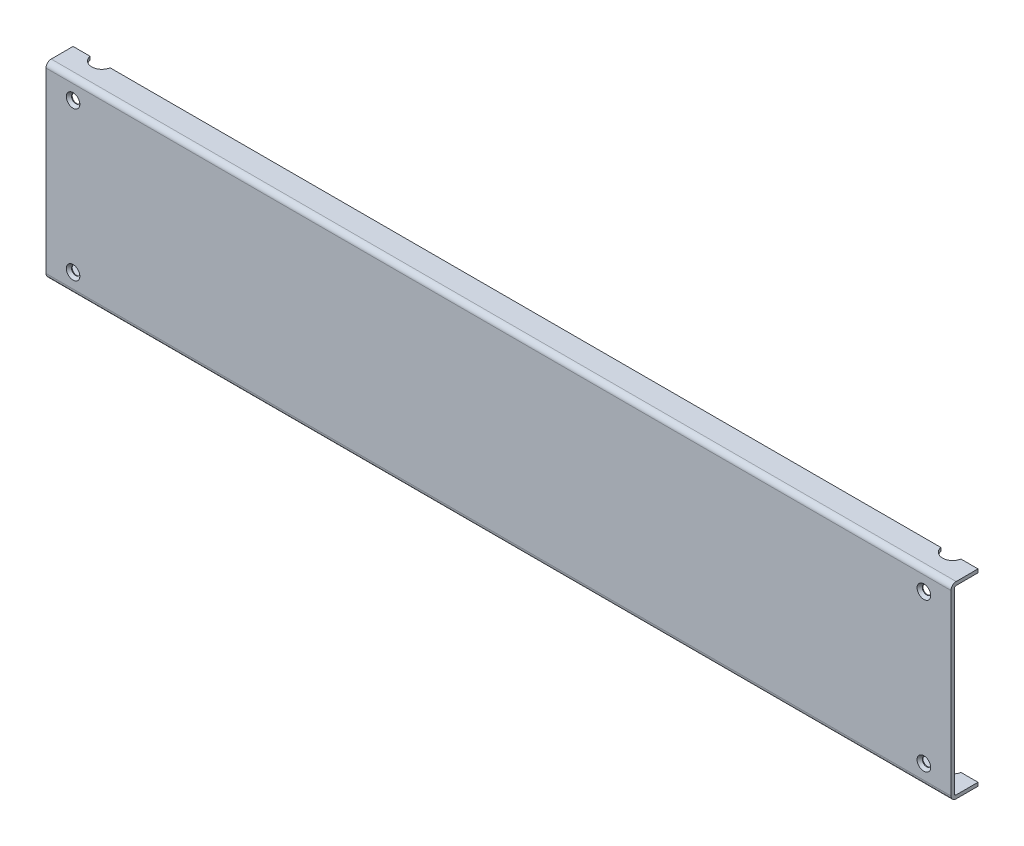
ISO-10303-21;
HEADER;
FILE_DESCRIPTION(('STEP AP214'),'2;1');
FILE_NAME('part.step','',(''),(''),'','','');
FILE_SCHEMA(('AUTOMOTIVE_DESIGN { 1 0 10303 214 1 1 1 1 }'));
ENDSEC;
DATA;
#1=APPLICATION_CONTEXT('core data for automotive mechanical design processes');
#2=APPLICATION_PROTOCOL_DEFINITION('international standard','automotive_design',2000,#1);
#3=PRODUCT_CONTEXT('',#1,'mechanical');
#4=PRODUCT('Part','Part','',(#3));
#5=PRODUCT_RELATED_PRODUCT_CATEGORY('part','',(#4));
#6=PRODUCT_DEFINITION_FORMATION('','',#4);
#7=PRODUCT_DEFINITION_CONTEXT('part definition',#1,'design');
#8=PRODUCT_DEFINITION('design','',#6,#7);
#9=PRODUCT_DEFINITION_SHAPE('','',#8);
#10=(LENGTH_UNIT() NAMED_UNIT(*) SI_UNIT(.MILLI.,.METRE.));
#11=(NAMED_UNIT(*) PLANE_ANGLE_UNIT() SI_UNIT($,.RADIAN.));
#12=(NAMED_UNIT(*) SI_UNIT($,.STERADIAN.) SOLID_ANGLE_UNIT());
#13=UNCERTAINTY_MEASURE_WITH_UNIT(LENGTH_MEASURE(1.E-05),#10,'distance_accuracy_value','');
#14=(GEOMETRIC_REPRESENTATION_CONTEXT(3) GLOBAL_UNCERTAINTY_ASSIGNED_CONTEXT((#13)) GLOBAL_UNIT_ASSIGNED_CONTEXT((#10,
#11,#12)) REPRESENTATION_CONTEXT('',''));
#15=CARTESIAN_POINT('',(0.,0.,0.));
#16=DIRECTION('',(0.,0.,1.));
#17=DIRECTION('',(1.,0.,0.));
#18=AXIS2_PLACEMENT_3D('',#15,#16,#17);
#19=CARTESIAN_POINT('',(199.6186,389.769720897378,-13.5382));
#20=DIRECTION('',(0.,1.,0.));
#21=DIRECTION('',(0.,0.,1.));
#22=AXIS2_PLACEMENT_3D('',#19,#20,#21);
#23=CYLINDRICAL_SURFACE('',#22,4.7752);
#24=CARTESIAN_POINT('',(199.6186,-42.545,-13.5382));
#25=DIRECTION('',(0.,1.,0.));
#26=DIRECTION('',(0.,0.,1.));
#27=AXIS2_PLACEMENT_3D('',#24,#25,#26);
#28=CIRCLE('',#27,4.7752);
#29=CARTESIAN_POINT('',(194.917540991649,-42.545,-12.7));
#30=VERTEX_POINT('',#29);
#31=CARTESIAN_POINT('',(204.319659008351,-42.545,-12.7));
#32=VERTEX_POINT('',#31);
#33=EDGE_CURVE('E266',#30,#32,#28,.T.);
#34=ORIENTED_EDGE('',*,*,#33,.T.);
#35=DIRECTION('',(0.,1.,0.));
#36=VECTOR('',#35,1.);
#37=CARTESIAN_POINT('',(204.319659008351,-44.1706,-12.7));
#38=LINE('',#37,#36);
#39=CARTESIAN_POINT('',(204.319659008351,-44.1706,-12.7));
#40=VERTEX_POINT('',#39);
#41=EDGE_CURVE('E194',#32,#40,#38,.F.);
#42=ORIENTED_EDGE('',*,*,#41,.T.);
#43=CARTESIAN_POINT('',(199.6186,-44.1706,-13.5382));
#44=DIRECTION('',(0.,1.,0.));
#45=DIRECTION('',(0.,0.,1.));
#46=AXIS2_PLACEMENT_3D('',#43,#44,#45);
#47=CIRCLE('',#46,4.7752);
#48=CARTESIAN_POINT('',(194.917540991649,-44.1706,-12.7));
#49=VERTEX_POINT('',#48);
#50=EDGE_CURVE('E271',#49,#40,#47,.T.);
#51=ORIENTED_EDGE('',*,*,#50,.F.);
#52=DIRECTION('',(0.,1.,0.));
#53=VECTOR('',#52,1.);
#54=CARTESIAN_POINT('',(194.917540991649,-44.1706,-12.7));
#55=LINE('',#54,#53);
#56=EDGE_CURVE('E186',#49,#30,#55,.T.);
#57=ORIENTED_EDGE('',*,*,#56,.T.);
#58=EDGE_LOOP('',(#34,#42,#51,#57));
#59=FACE_BOUND('',#58,.T.);
#60=ADVANCED_FACE('F17',(#59),#23,.F.);
#61=CARTESIAN_POINT('',(-212.3186,-44.1706,-12.7));
#62=DIRECTION('',(0.,0.,1.));
#63=DIRECTION('',(1.,0.,0.));
#64=AXIS2_PLACEMENT_3D('',#61,#62,#63);
#65=PLANE('',#64);
#66=DIRECTION('',(1.,0.,0.));
#67=VECTOR('',#66,1.);
#68=CARTESIAN_POINT('',(212.3186,-42.545,-12.7));
#69=LINE('',#68,#67);
#70=CARTESIAN_POINT('',(212.3186,-42.545,-12.7));
#71=VERTEX_POINT('',#70);
#72=EDGE_CURVE('E269',#32,#71,#69,.T.);
#73=ORIENTED_EDGE('',*,*,#72,.T.);
#74=DIRECTION('',(0.,1.,0.));
#75=VECTOR('',#74,1.);
#76=CARTESIAN_POINT('',(212.3186,-44.1706,-12.7));
#77=LINE('',#76,#75);
#78=CARTESIAN_POINT('',(212.3186,-44.1706,-12.7));
#79=VERTEX_POINT('',#78);
#80=EDGE_CURVE('E199',#79,#71,#77,.T.);
#81=ORIENTED_EDGE('',*,*,#80,.F.);
#82=DIRECTION('',(1.,0.,0.));
#83=VECTOR('',#82,1.);
#84=CARTESIAN_POINT('',(212.3186,-44.1706,-12.7));
#85=LINE('',#84,#83);
#86=EDGE_CURVE('E273',#40,#79,#85,.T.);
#87=ORIENTED_EDGE('',*,*,#86,.F.);
#88=ORIENTED_EDGE('',*,*,#41,.F.);
#89=EDGE_LOOP('',(#73,#81,#87,#88));
#90=FACE_BOUND('',#89,.T.);
#91=ADVANCED_FACE('F462',(#90),#65,.F.);
#92=CARTESIAN_POINT('',(-212.3186,-44.1706,-12.7));
#93=DIRECTION('',(0.,0.,1.));
#94=DIRECTION('',(1.,0.,0.));
#95=AXIS2_PLACEMENT_3D('',#92,#93,#94);
#96=PLANE('',#95);
#97=DIRECTION('',(0.,1.,0.));
#98=VECTOR('',#97,1.);
#99=CARTESIAN_POINT('',(-204.319659008351,389.769720897378,-12.6999999999999));
#100=LINE('',#99,#98);
#101=CARTESIAN_POINT('',(-204.319659008351,-42.545,-12.7));
#102=VERTEX_POINT('',#101);
#103=CARTESIAN_POINT('',(-204.319659008351,-44.1706,-12.7));
#104=VERTEX_POINT('',#103);
#105=EDGE_CURVE('E189',#102,#104,#100,.F.);
#106=ORIENTED_EDGE('',*,*,#105,.T.);
#107=DIRECTION('',(1.,0.,0.));
#108=VECTOR('',#107,1.);
#109=CARTESIAN_POINT('',(212.3186,-44.1706,-12.7));
#110=LINE('',#109,#108);
#111=CARTESIAN_POINT('',(-212.3186,-44.1706,-12.7));
#112=VERTEX_POINT('',#111);
#113=EDGE_CURVE('E270',#112,#104,#110,.T.);
#114=ORIENTED_EDGE('',*,*,#113,.F.);
#115=DIRECTION('',(0.,1.,0.));
#116=VECTOR('',#115,1.);
#117=CARTESIAN_POINT('',(-212.3186,-44.1706,-12.7));
#118=LINE('',#117,#116);
#119=CARTESIAN_POINT('',(-212.3186,-42.545,-12.7));
#120=VERTEX_POINT('',#119);
#121=EDGE_CURVE('E191',#120,#112,#118,.F.);
#122=ORIENTED_EDGE('',*,*,#121,.F.);
#123=DIRECTION('',(1.,0.,0.));
#124=VECTOR('',#123,1.);
#125=CARTESIAN_POINT('',(212.3186,-42.545,-12.7));
#126=LINE('',#125,#124);
#127=EDGE_CURVE('E265',#120,#102,#126,.T.);
#128=ORIENTED_EDGE('',*,*,#127,.T.);
#129=EDGE_LOOP('',(#106,#114,#122,#128));
#130=FACE_BOUND('',#129,.T.);
#131=ADVANCED_FACE('F469',(#130),#96,.F.);
#132=CARTESIAN_POINT('',(-199.6186,389.769720897378,-13.5382));
#133=DIRECTION('',(0.,1.,0.));
#134=DIRECTION('',(0.,0.,1.));
#135=AXIS2_PLACEMENT_3D('',#132,#133,#134);
#136=CYLINDRICAL_SURFACE('',#135,4.7752);
#137=DIRECTION('',(0.,1.,0.));
#138=VECTOR('',#137,1.);
#139=CARTESIAN_POINT('',(-194.917540991649,-44.1706,-12.7));
#140=LINE('',#139,#138);
#141=CARTESIAN_POINT('',(-194.917540991649,-42.545,-12.7));
#142=VERTEX_POINT('',#141);
#143=CARTESIAN_POINT('',(-194.917540991649,-44.1706,-12.7));
#144=VERTEX_POINT('',#143);
#145=EDGE_CURVE('E181',#142,#144,#140,.F.);
#146=ORIENTED_EDGE('',*,*,#145,.T.);
#147=CARTESIAN_POINT('',(-199.6186,-44.1706,-13.5382));
#148=DIRECTION('',(0.,1.,0.));
#149=DIRECTION('',(0.,0.,1.));
#150=AXIS2_PLACEMENT_3D('',#147,#148,#149);
#151=CIRCLE('',#150,4.7752);
#152=EDGE_CURVE('E275',#104,#144,#151,.T.);
#153=ORIENTED_EDGE('',*,*,#152,.F.);
#154=ORIENTED_EDGE('',*,*,#105,.F.);
#155=CARTESIAN_POINT('',(-199.6186,-42.545,-13.5382));
#156=DIRECTION('',(0.,1.,0.));
#157=DIRECTION('',(0.,0.,1.));
#158=AXIS2_PLACEMENT_3D('',#155,#156,#157);
#159=CIRCLE('',#158,4.7752);
#160=EDGE_CURVE('E261',#102,#142,#159,.T.);
#161=ORIENTED_EDGE('',*,*,#160,.T.);
#162=EDGE_LOOP('',(#146,#153,#154,#161));
#163=FACE_BOUND('',#162,.T.);
#164=ADVANCED_FACE('F473',(#163),#136,.F.);
#165=CARTESIAN_POINT('',(-212.3186,-44.1706,-12.7));
#166=DIRECTION('',(0.,0.,1.));
#167=DIRECTION('',(1.,0.,0.));
#168=AXIS2_PLACEMENT_3D('',#165,#166,#167);
#169=PLANE('',#168);
#170=ORIENTED_EDGE('',*,*,#145,.F.);
#171=DIRECTION('',(1.,0.,0.));
#172=VECTOR('',#171,1.);
#173=CARTESIAN_POINT('',(212.3186,-42.545,-12.7));
#174=LINE('',#173,#172);
#175=EDGE_CURVE('E264',#142,#30,#174,.T.);
#176=ORIENTED_EDGE('',*,*,#175,.T.);
#177=ORIENTED_EDGE('',*,*,#56,.F.);
#178=DIRECTION('',(1.,0.,0.));
#179=VECTOR('',#178,1.);
#180=CARTESIAN_POINT('',(212.3186,-44.1706,-12.7));
#181=LINE('',#180,#179);
#182=EDGE_CURVE('E274',#144,#49,#181,.T.);
#183=ORIENTED_EDGE('',*,*,#182,.F.);
#184=EDGE_LOOP('',(#170,#176,#177,#183));
#185=FACE_BOUND('',#184,.T.);
#186=ADVANCED_FACE('F476',(#185),#169,.F.);
#187=CARTESIAN_POINT('',(212.3186,44.1706,-12.7));
#188=DIRECTION('',(0.,0.,1.));
#189=DIRECTION('',(1.,0.,0.));
#190=AXIS2_PLACEMENT_3D('',#187,#188,#189);
#191=PLANE('',#190);
#192=DIRECTION('',(1.,0.,0.));
#193=VECTOR('',#192,1.);
#194=CARTESIAN_POINT('',(-212.3186,44.1706,-12.7));
#195=LINE('',#194,#193);
#196=CARTESIAN_POINT('',(212.3186,44.1706,-12.7));
#197=VERTEX_POINT('',#196);
#198=CARTESIAN_POINT('',(204.319659008351,44.1706,-12.7));
#199=VERTEX_POINT('',#198);
#200=EDGE_CURVE('E159',#197,#199,#195,.F.);
#201=ORIENTED_EDGE('',*,*,#200,.F.);
#202=DIRECTION('',(0.,1.,0.));
#203=VECTOR('',#202,1.);
#204=CARTESIAN_POINT('',(212.3186,44.1706,-12.7));
#205=LINE('',#204,#203);
#206=CARTESIAN_POINT('',(212.3186,42.545,-12.7));
#207=VERTEX_POINT('',#206);
#208=EDGE_CURVE('E178',#207,#197,#205,.T.);
#209=ORIENTED_EDGE('',*,*,#208,.F.);
#210=DIRECTION('',(1.,0.,0.));
#211=VECTOR('',#210,1.);
#212=CARTESIAN_POINT('',(-212.3186,42.545,-12.7));
#213=LINE('',#212,#211);
#214=CARTESIAN_POINT('',(204.319659008351,42.545,-12.7));
#215=VERTEX_POINT('',#214);
#216=EDGE_CURVE('E260',#207,#215,#213,.F.);
#217=ORIENTED_EDGE('',*,*,#216,.T.);
#218=DIRECTION('',(0.,-1.,0.));
#219=VECTOR('',#218,1.);
#220=CARTESIAN_POINT('',(204.319659008351,-389.769720897378,-12.6999999999999));
#221=LINE('',#220,#219);
#222=EDGE_CURVE('E175',#215,#199,#221,.F.);
#223=ORIENTED_EDGE('',*,*,#222,.T.);
#224=EDGE_LOOP('',(#201,#209,#217,#223));
#225=FACE_BOUND('',#224,.T.);
#226=ADVANCED_FACE('F438',(#225),#191,.F.);
#227=CARTESIAN_POINT('',(199.6186,-389.769720897378,-13.5382));
#228=DIRECTION('',(0.,-1.,0.));
#229=DIRECTION('',(0.,0.,-1.));
#230=AXIS2_PLACEMENT_3D('',#227,#228,#229);
#231=CYLINDRICAL_SURFACE('',#230,4.7752);
#232=CARTESIAN_POINT('',(199.6186,42.545,-13.5382));
#233=DIRECTION('',(0.,-1.,0.));
#234=DIRECTION('',(0.,0.,-1.));
#235=AXIS2_PLACEMENT_3D('',#232,#233,#234);
#236=CIRCLE('',#235,4.7752);
#237=CARTESIAN_POINT('',(194.917540991649,42.545,-12.7));
#238=VERTEX_POINT('',#237);
#239=EDGE_CURVE('E257',#215,#238,#236,.T.);
#240=ORIENTED_EDGE('',*,*,#239,.T.);
#241=DIRECTION('',(0.,1.,0.));
#242=VECTOR('',#241,1.);
#243=CARTESIAN_POINT('',(194.917540991649,44.1706,-12.7));
#244=LINE('',#243,#242);
#245=CARTESIAN_POINT('',(194.917540991649,44.1706,-12.7));
#246=VERTEX_POINT('',#245);
#247=EDGE_CURVE('E172',#238,#246,#244,.T.);
#248=ORIENTED_EDGE('',*,*,#247,.T.);
#249=CARTESIAN_POINT('',(199.6186,44.1706,-13.5382));
#250=DIRECTION('',(0.,-1.,0.));
#251=DIRECTION('',(0.,0.,-1.));
#252=AXIS2_PLACEMENT_3D('',#249,#250,#251);
#253=CIRCLE('',#252,4.7752);
#254=EDGE_CURVE('E161',#199,#246,#253,.T.);
#255=ORIENTED_EDGE('',*,*,#254,.F.);
#256=ORIENTED_EDGE('',*,*,#222,.F.);
#257=EDGE_LOOP('',(#240,#248,#255,#256));
#258=FACE_BOUND('',#257,.T.);
#259=ADVANCED_FACE('F495',(#258),#231,.F.);
#260=CARTESIAN_POINT('',(212.3186,44.1706,-12.7));
#261=DIRECTION('',(0.,0.,1.));
#262=DIRECTION('',(1.,0.,0.));
#263=AXIS2_PLACEMENT_3D('',#260,#261,#262);
#264=PLANE('',#263);
#265=DIRECTION('',(0.,-1.,0.));
#266=VECTOR('',#265,1.);
#267=CARTESIAN_POINT('',(-194.917540991649,-389.769720897378,-12.6999999999999));
#268=LINE('',#267,#266);
#269=CARTESIAN_POINT('',(-194.917540991649,42.545,-12.7));
#270=VERTEX_POINT('',#269);
#271=CARTESIAN_POINT('',(-194.917540991649,44.1706,-12.7));
#272=VERTEX_POINT('',#271);
#273=EDGE_CURVE('E132',#270,#272,#268,.F.);
#274=ORIENTED_EDGE('',*,*,#273,.T.);
#275=DIRECTION('',(1.,0.,0.));
#276=VECTOR('',#275,1.);
#277=CARTESIAN_POINT('',(-212.3186,44.1706,-12.7));
#278=LINE('',#277,#276);
#279=EDGE_CURVE('E144',#246,#272,#278,.F.);
#280=ORIENTED_EDGE('',*,*,#279,.F.);
#281=ORIENTED_EDGE('',*,*,#247,.F.);
#282=DIRECTION('',(1.,0.,0.));
#283=VECTOR('',#282,1.);
#284=CARTESIAN_POINT('',(-212.3186,42.545,-12.7));
#285=LINE('',#284,#283);
#286=EDGE_CURVE('E256',#238,#270,#285,.F.);
#287=ORIENTED_EDGE('',*,*,#286,.T.);
#288=EDGE_LOOP('',(#274,#280,#281,#287));
#289=FACE_BOUND('',#288,.T.);
#290=ADVANCED_FACE('F498',(#289),#264,.F.);
#291=CARTESIAN_POINT('',(-199.6186,-389.769720897378,-13.5382));
#292=DIRECTION('',(0.,-1.,0.));
#293=DIRECTION('',(0.,0.,-1.));
#294=AXIS2_PLACEMENT_3D('',#291,#292,#293);
#295=CYLINDRICAL_SURFACE('',#294,4.7752);
#296=DIRECTION('',(0.,1.,0.));
#297=VECTOR('',#296,1.);
#298=CARTESIAN_POINT('',(-204.319659008351,44.1706,-12.7));
#299=LINE('',#298,#297);
#300=CARTESIAN_POINT('',(-204.319659008351,42.545,-12.7));
#301=VERTEX_POINT('',#300);
#302=CARTESIAN_POINT('',(-204.319659008351,44.1706,-12.7));
#303=VERTEX_POINT('',#302);
#304=EDGE_CURVE('E146',#301,#303,#299,.T.);
#305=ORIENTED_EDGE('',*,*,#304,.T.);
#306=CARTESIAN_POINT('',(-199.6186,44.1706,-13.5382));
#307=DIRECTION('',(0.,-1.,0.));
#308=DIRECTION('',(0.,0.,-1.));
#309=AXIS2_PLACEMENT_3D('',#306,#307,#308);
#310=CIRCLE('',#309,4.7752);
#311=EDGE_CURVE('E20',#272,#303,#310,.T.);
#312=ORIENTED_EDGE('',*,*,#311,.F.);
#313=ORIENTED_EDGE('',*,*,#273,.F.);
#314=CARTESIAN_POINT('',(-199.6186,42.545,-13.5382));
#315=DIRECTION('',(0.,-1.,0.));
#316=DIRECTION('',(0.,0.,-1.));
#317=AXIS2_PLACEMENT_3D('',#314,#315,#316);
#318=CIRCLE('',#317,4.7752);
#319=EDGE_CURVE('E150',#270,#301,#318,.T.);
#320=ORIENTED_EDGE('',*,*,#319,.T.);
#321=EDGE_LOOP('',(#305,#312,#313,#320));
#322=FACE_BOUND('',#321,.T.);
#323=ADVANCED_FACE('F148',(#322),#295,.F.);
#324=CARTESIAN_POINT('',(212.3186,44.1706,-12.7));
#325=DIRECTION('',(0.,0.,1.));
#326=DIRECTION('',(1.,0.,0.));
#327=AXIS2_PLACEMENT_3D('',#324,#325,#326);
#328=PLANE('',#327);
#329=ORIENTED_EDGE('',*,*,#304,.F.);
#330=DIRECTION('',(1.,0.,0.));
#331=VECTOR('',#330,1.);
#332=CARTESIAN_POINT('',(-212.3186,42.545,-12.7));
#333=LINE('',#332,#331);
#334=CARTESIAN_POINT('',(-212.3186,42.545,-12.7));
#335=VERTEX_POINT('',#334);
#336=EDGE_CURVE('E254',#301,#335,#333,.F.);
#337=ORIENTED_EDGE('',*,*,#336,.T.);
#338=DIRECTION('',(0.,1.,0.));
#339=VECTOR('',#338,1.);
#340=CARTESIAN_POINT('',(-212.3186,44.1706,-12.7));
#341=LINE('',#340,#339);
#342=CARTESIAN_POINT('',(-212.3186,44.1706,-12.7));
#343=VERTEX_POINT('',#342);
#344=EDGE_CURVE('E154',#343,#335,#341,.F.);
#345=ORIENTED_EDGE('',*,*,#344,.F.);
#346=DIRECTION('',(1.,0.,0.));
#347=VECTOR('',#346,1.);
#348=CARTESIAN_POINT('',(-212.3186,44.1706,-12.7));
#349=LINE('',#348,#347);
#350=EDGE_CURVE('E142',#303,#343,#349,.F.);
#351=ORIENTED_EDGE('',*,*,#350,.F.);
#352=EDGE_LOOP('',(#329,#337,#345,#351));
#353=FACE_BOUND('',#352,.T.);
#354=ADVANCED_FACE('F157',(#353),#328,.F.);
#355=CARTESIAN_POINT('',(-212.3186,44.1706,-1.38393774617544));
#356=DIRECTION('',(0.,1.,0.));
#357=DIRECTION('',(0.,0.,1.));
#358=AXIS2_PLACEMENT_3D('',#355,#356,#357);
#359=PLANE('',#358);
#360=ORIENTED_EDGE('',*,*,#254,.T.);
#361=ORIENTED_EDGE('',*,*,#279,.T.);
#362=ORIENTED_EDGE('',*,*,#311,.T.);
#363=ORIENTED_EDGE('',*,*,#350,.T.);
#364=DIRECTION('',(0.,0.,1.));
#365=VECTOR('',#364,1.);
#366=CARTESIAN_POINT('',(-212.3186,44.1706,-1.6256));
#367=LINE('',#366,#365);
#368=CARTESIAN_POINT('',(-212.3186,44.1706,-2.4384));
#369=VERTEX_POINT('',#368);
#370=EDGE_CURVE('E240',#369,#343,#367,.F.);
#371=ORIENTED_EDGE('',*,*,#370,.F.);
#372=DIRECTION('',(1.,0.,0.));
#373=VECTOR('',#372,1.);
#374=CARTESIAN_POINT('',(212.3186,44.1706,-2.4384));
#375=LINE('',#374,#373);
#376=CARTESIAN_POINT('',(212.3186,44.1706,-2.4384));
#377=VERTEX_POINT('',#376);
#378=EDGE_CURVE('E278',#377,#369,#375,.F.);
#379=ORIENTED_EDGE('',*,*,#378,.F.);
#380=DIRECTION('',(0.,0.,-1.));
#381=VECTOR('',#380,1.);
#382=CARTESIAN_POINT('',(212.3186,44.1706,-1.6256));
#383=LINE('',#382,#381);
#384=EDGE_CURVE('E228',#197,#377,#383,.F.);
#385=ORIENTED_EDGE('',*,*,#384,.F.);
#386=ORIENTED_EDGE('',*,*,#200,.T.);
#387=EDGE_LOOP('',(#360,#361,#362,#363,#371,#379,#385,#386));
#388=FACE_BOUND('',#387,.T.);
#389=ADVANCED_FACE('F139',(#388),#359,.T.);
#390=CARTESIAN_POINT('',(212.3186,41.7322,-2.4384));
#391=DIRECTION('',(1.,0.,0.));
#392=DIRECTION('',(0.,0.,-1.));
#393=AXIS2_PLACEMENT_3D('',#390,#391,#392);
#394=CYLINDRICAL_SURFACE('',#393,2.4384);
#395=ORIENTED_EDGE('',*,*,#378,.T.);
#396=CARTESIAN_POINT('',(-212.3186,41.7322,-2.4384));
#397=DIRECTION('',(1.,0.,0.));
#398=DIRECTION('',(0.,0.,-1.));
#399=AXIS2_PLACEMENT_3D('',#396,#397,#398);
#400=CIRCLE('',#399,2.4384);
#401=CARTESIAN_POINT('',(-212.3186,41.7322,0.));
#402=VERTEX_POINT('',#401);
#403=EDGE_CURVE('E237',#402,#369,#400,.F.);
#404=ORIENTED_EDGE('',*,*,#403,.F.);
#405=DIRECTION('',(1.,0.,0.));
#406=VECTOR('',#405,1.);
#407=CARTESIAN_POINT('',(-212.3186,41.7322,0.));
#408=LINE('',#407,#406);
#409=CARTESIAN_POINT('',(212.3186,41.7322,0.));
#410=VERTEX_POINT('',#409);
#411=EDGE_CURVE('E280',#410,#402,#408,.F.);
#412=ORIENTED_EDGE('',*,*,#411,.F.);
#413=CARTESIAN_POINT('',(212.3186,41.7322,-2.4384));
#414=DIRECTION('',(1.,0.,0.));
#415=DIRECTION('',(0.,0.,-1.));
#416=AXIS2_PLACEMENT_3D('',#413,#414,#415);
#417=CIRCLE('',#416,2.4384);
#418=EDGE_CURVE('E226',#377,#410,#417,.T.);
#419=ORIENTED_EDGE('',*,*,#418,.F.);
#420=EDGE_LOOP('',(#395,#404,#412,#419));
#421=FACE_BOUND('',#420,.T.);
#422=ADVANCED_FACE('F443',(#421),#394,.T.);
#423=CARTESIAN_POINT('',(-212.3186,-44.1706,0.));
#424=DIRECTION('',(0.,0.,1.));
#425=DIRECTION('',(1.,0.,0.));
#426=AXIS2_PLACEMENT_3D('',#423,#424,#425);
#427=PLANE('',#426);
#428=CARTESIAN_POINT('',(199.6186,-34.925,0.));
#429=DIRECTION('',(0.,0.,1.));
#430=DIRECTION('',(1.,0.,0.));
#431=AXIS2_PLACEMENT_3D('',#428,#429,#430);
#432=CIRCLE('',#431,3.17500000000439);
#433=CARTESIAN_POINT('',(202.793600000004,-34.925,0.));
#434=VERTEX_POINT('',#433);
#435=EDGE_CURVE('E242',#434,#434,#432,.F.);
#436=ORIENTED_EDGE('',*,*,#435,.T.);
#437=EDGE_LOOP('',(#436));
#438=FACE_BOUND('',#437,.T.);
#439=CARTESIAN_POINT('',(199.6186,34.925,0.));
#440=DIRECTION('',(0.,0.,1.));
#441=DIRECTION('',(1.,0.,0.));
#442=AXIS2_PLACEMENT_3D('',#439,#440,#441);
#443=CIRCLE('',#442,3.17499999997838);
#444=CARTESIAN_POINT('',(202.793599999978,34.925,0.));
#445=VERTEX_POINT('',#444);
#446=EDGE_CURVE('E245',#445,#445,#443,.F.);
#447=ORIENTED_EDGE('',*,*,#446,.T.);
#448=EDGE_LOOP('',(#447));
#449=FACE_BOUND('',#448,.T.);
#450=CARTESIAN_POINT('',(-199.6186,34.925,0.));
#451=DIRECTION('',(0.,0.,1.));
#452=DIRECTION('',(1.,0.,0.));
#453=AXIS2_PLACEMENT_3D('',#450,#451,#452);
#454=CIRCLE('',#453,3.17499999997838);
#455=CARTESIAN_POINT('',(-196.443600000022,34.925,0.));
#456=VERTEX_POINT('',#455);
#457=EDGE_CURVE('E248',#456,#456,#454,.F.);
#458=ORIENTED_EDGE('',*,*,#457,.T.);
#459=EDGE_LOOP('',(#458));
#460=FACE_BOUND('',#459,.T.);
#461=CARTESIAN_POINT('',(-199.6186,-34.925,0.));
#462=DIRECTION('',(0.,0.,1.));
#463=DIRECTION('',(1.,0.,0.));
#464=AXIS2_PLACEMENT_3D('',#461,#462,#463);
#465=CIRCLE('',#464,3.17500000000439);
#466=CARTESIAN_POINT('',(-196.443599999996,-34.925,0.));
#467=VERTEX_POINT('',#466);
#468=EDGE_CURVE('E251',#467,#467,#465,.F.);
#469=ORIENTED_EDGE('',*,*,#468,.T.);
#470=EDGE_LOOP('',(#469));
#471=FACE_BOUND('',#470,.T.);
#472=DIRECTION('',(0.,-1.,0.));
#473=VECTOR('',#472,1.);
#474=CARTESIAN_POINT('',(-212.3186,44.1706,0.));
#475=LINE('',#474,#473);
#476=CARTESIAN_POINT('',(-212.3186,-41.7322,0.));
#477=VERTEX_POINT('',#476);
#478=EDGE_CURVE('E241',#477,#402,#475,.F.);
#479=ORIENTED_EDGE('',*,*,#478,.F.);
#480=DIRECTION('',(-1.,0.,0.));
#481=VECTOR('',#480,1.);
#482=CARTESIAN_POINT('',(-212.3186,-41.7322,0.));
#483=LINE('',#482,#481);
#484=CARTESIAN_POINT('',(212.3186,-41.7322,0.));
#485=VERTEX_POINT('',#484);
#486=EDGE_CURVE('E276',#485,#477,#483,.T.);
#487=ORIENTED_EDGE('',*,*,#486,.F.);
#488=DIRECTION('',(0.,1.,0.));
#489=VECTOR('',#488,1.);
#490=CARTESIAN_POINT('',(212.3186,-44.1706,0.));
#491=LINE('',#490,#489);
#492=EDGE_CURVE('E225',#410,#485,#491,.F.);
#493=ORIENTED_EDGE('',*,*,#492,.F.);
#494=ORIENTED_EDGE('',*,*,#411,.T.);
#495=EDGE_LOOP('',(#479,#487,#493,#494));
#496=FACE_BOUND('',#495,.T.);
#497=ADVANCED_FACE('F450',(#438,#449,#460,#471,#496),#427,.T.);
#498=CARTESIAN_POINT('',(-212.3186,-41.7322,-2.4384));
#499=DIRECTION('',(-1.,0.,0.));
#500=DIRECTION('',(0.,0.,1.));
#501=AXIS2_PLACEMENT_3D('',#498,#499,#500);
#502=CYLINDRICAL_SURFACE('',#501,2.4384);
#503=DIRECTION('',(1.,0.,0.));
#504=VECTOR('',#503,1.);
#505=CARTESIAN_POINT('',(212.3186,-44.1706,-2.4384));
#506=LINE('',#505,#504);
#507=CARTESIAN_POINT('',(212.3186,-44.1706,-2.4384));
#508=VERTEX_POINT('',#507);
#509=CARTESIAN_POINT('',(-212.3186,-44.1706,-2.4384));
#510=VERTEX_POINT('',#509);
#511=EDGE_CURVE('E285',#508,#510,#506,.F.);
#512=ORIENTED_EDGE('',*,*,#511,.F.);
#513=CARTESIAN_POINT('',(212.3186,-41.7322,-2.4384));
#514=DIRECTION('',(-1.,0.,0.));
#515=DIRECTION('',(0.,0.,1.));
#516=AXIS2_PLACEMENT_3D('',#513,#514,#515);
#517=CIRCLE('',#516,2.4384);
#518=EDGE_CURVE('E222',#485,#508,#517,.F.);
#519=ORIENTED_EDGE('',*,*,#518,.F.);
#520=ORIENTED_EDGE('',*,*,#486,.T.);
#521=CARTESIAN_POINT('',(-212.3186,-41.7322,-2.4384));
#522=DIRECTION('',(-1.,0.,0.));
#523=DIRECTION('',(0.,0.,1.));
#524=AXIS2_PLACEMENT_3D('',#521,#522,#523);
#525=CIRCLE('',#524,2.4384);
#526=EDGE_CURVE('E233',#510,#477,#525,.T.);
#527=ORIENTED_EDGE('',*,*,#526,.F.);
#528=EDGE_LOOP('',(#512,#519,#520,#527));
#529=FACE_BOUND('',#528,.T.);
#530=ADVANCED_FACE('F453',(#529),#502,.T.);
#531=CARTESIAN_POINT('',(212.3186,-44.1706,-1.38393774617544));
#532=DIRECTION('',(0.,-1.,0.));
#533=DIRECTION('',(0.,0.,-1.));
#534=AXIS2_PLACEMENT_3D('',#531,#532,#533);
#535=PLANE('',#534);
#536=DIRECTION('',(0.,0.,1.));
#537=VECTOR('',#536,1.);
#538=CARTESIAN_POINT('',(-212.3186,-44.1706,-1.6256));
#539=LINE('',#538,#537);
#540=EDGE_CURVE('E236',#112,#510,#539,.T.);
#541=ORIENTED_EDGE('',*,*,#540,.F.);
#542=ORIENTED_EDGE('',*,*,#113,.T.);
#543=ORIENTED_EDGE('',*,*,#152,.T.);
#544=ORIENTED_EDGE('',*,*,#182,.T.);
#545=ORIENTED_EDGE('',*,*,#50,.T.);
#546=ORIENTED_EDGE('',*,*,#86,.T.);
#547=DIRECTION('',(0.,0.,-1.));
#548=VECTOR('',#547,1.);
#549=CARTESIAN_POINT('',(212.3186,-44.1706,-1.6256));
#550=LINE('',#549,#548);
#551=EDGE_CURVE('E224',#508,#79,#550,.T.);
#552=ORIENTED_EDGE('',*,*,#551,.F.);
#553=ORIENTED_EDGE('',*,*,#511,.T.);
#554=EDGE_LOOP('',(#541,#542,#543,#544,#545,#546,#552,#553));
#555=FACE_BOUND('',#554,.T.);
#556=ADVANCED_FACE('F457',(#555),#535,.T.);
#557=CARTESIAN_POINT('',(212.3186,-42.545,-1.38393774617544));
#558=DIRECTION('',(0.,-1.,0.));
#559=DIRECTION('',(0.,0.,-1.));
#560=AXIS2_PLACEMENT_3D('',#557,#558,#559);
#561=PLANE('',#560);
#562=ORIENTED_EDGE('',*,*,#160,.F.);
#563=ORIENTED_EDGE('',*,*,#127,.F.);
#564=DIRECTION('',(0.,0.,1.));
#565=VECTOR('',#564,1.);
#566=CARTESIAN_POINT('',(-212.3186,-42.545,-1.6256));
#567=LINE('',#566,#565);
#568=CARTESIAN_POINT('',(-212.3186,-42.545,-2.4384));
#569=VERTEX_POINT('',#568);
#570=EDGE_CURVE('E330',#569,#120,#567,.F.);
#571=ORIENTED_EDGE('',*,*,#570,.F.);
#572=DIRECTION('',(-1.,0.,0.));
#573=VECTOR('',#572,1.);
#574=CARTESIAN_POINT('',(-212.3186,-42.545,-2.4384));
#575=LINE('',#574,#573);
#576=CARTESIAN_POINT('',(212.3186,-42.545,-2.4384));
#577=VERTEX_POINT('',#576);
#578=EDGE_CURVE('E232',#569,#577,#575,.F.);
#579=ORIENTED_EDGE('',*,*,#578,.T.);
#580=DIRECTION('',(0.,0.,-1.));
#581=VECTOR('',#580,1.);
#582=CARTESIAN_POINT('',(212.3186,-42.545,-1.6256));
#583=LINE('',#582,#581);
#584=EDGE_CURVE('E221',#71,#577,#583,.F.);
#585=ORIENTED_EDGE('',*,*,#584,.F.);
#586=ORIENTED_EDGE('',*,*,#72,.F.);
#587=ORIENTED_EDGE('',*,*,#33,.F.);
#588=ORIENTED_EDGE('',*,*,#175,.F.);
#589=EDGE_LOOP('',(#562,#563,#571,#579,#585,#586,#587,#588));
#590=FACE_BOUND('',#589,.T.);
#591=ADVANCED_FACE('F465',(#590),#561,.F.);
#592=CARTESIAN_POINT('',(-212.3186,42.545,-1.38393774617544));
#593=DIRECTION('',(0.,1.,0.));
#594=DIRECTION('',(0.,0.,1.));
#595=AXIS2_PLACEMENT_3D('',#592,#593,#594);
#596=PLANE('',#595);
#597=ORIENTED_EDGE('',*,*,#319,.F.);
#598=ORIENTED_EDGE('',*,*,#286,.F.);
#599=ORIENTED_EDGE('',*,*,#239,.F.);
#600=ORIENTED_EDGE('',*,*,#216,.F.);
#601=DIRECTION('',(0.,0.,-1.));
#602=VECTOR('',#601,1.);
#603=CARTESIAN_POINT('',(212.3186,42.545,-1.6256));
#604=LINE('',#603,#602);
#605=CARTESIAN_POINT('',(212.3186,42.545,-2.4384));
#606=VERTEX_POINT('',#605);
#607=EDGE_CURVE('E309',#606,#207,#604,.T.);
#608=ORIENTED_EDGE('',*,*,#607,.F.);
#609=DIRECTION('',(1.,0.,0.));
#610=VECTOR('',#609,1.);
#611=CARTESIAN_POINT('',(212.3186,42.545,-2.4384));
#612=LINE('',#611,#610);
#613=CARTESIAN_POINT('',(-212.3186,42.545,-2.4384));
#614=VERTEX_POINT('',#613);
#615=EDGE_CURVE('E217',#606,#614,#612,.F.);
#616=ORIENTED_EDGE('',*,*,#615,.T.);
#617=DIRECTION('',(0.,0.,1.));
#618=VECTOR('',#617,1.);
#619=CARTESIAN_POINT('',(-212.3186,42.545,-1.6256));
#620=LINE('',#619,#618);
#621=EDGE_CURVE('E325',#335,#614,#620,.T.);
#622=ORIENTED_EDGE('',*,*,#621,.F.);
#623=ORIENTED_EDGE('',*,*,#336,.F.);
#624=EDGE_LOOP('',(#597,#598,#599,#600,#608,#616,#622,#623));
#625=FACE_BOUND('',#624,.T.);
#626=ADVANCED_FACE('F430',(#625),#596,.F.);
#627=CARTESIAN_POINT('',(-199.6186,-34.925,-5.6843418860808E-11));
#628=DIRECTION('',(0.,0.,1.));
#629=DIRECTION('',(1.,0.,0.));
#630=AXIS2_PLACEMENT_3D('',#627,#628,#629);
#631=CONICAL_SURFACE('',#630,3.17499999995498,0.715584993325368);
#632=CARTESIAN_POINT('',(-199.6186,-34.925,-1.31487108945361));
#633=DIRECTION('',(0.,0.,-1.));
#634=DIRECTION('',(-1.,0.,0.));
#635=AXIS2_PLACEMENT_3D('',#632,#633,#634);
#636=CIRCLE('',#635,2.032);
#637=CARTESIAN_POINT('',(-201.6506,-34.925,-1.31487108945361));
#638=VERTEX_POINT('',#637);
#639=EDGE_CURVE('E216',#638,#638,#636,.T.);
#640=ORIENTED_EDGE('',*,*,#639,.T.);
#641=EDGE_LOOP('',(#640));
#642=FACE_BOUND('',#641,.T.);
#643=ORIENTED_EDGE('',*,*,#468,.F.);
#644=EDGE_LOOP('',(#643));
#645=FACE_BOUND('',#644,.T.);
#646=ADVANCED_FACE('F521',(#642,#645),#631,.F.);
#647=CARTESIAN_POINT('',(-199.6186,34.925,-5.6843418860808E-11));
#648=DIRECTION('',(0.,0.,1.));
#649=DIRECTION('',(1.,0.,0.));
#650=AXIS2_PLACEMENT_3D('',#647,#648,#649);
#651=CONICAL_SURFACE('',#650,3.17499999992897,0.715584993325368);
#652=CARTESIAN_POINT('',(-199.6186,34.925,-1.31487108945361));
#653=DIRECTION('',(0.,0.,-1.));
#654=DIRECTION('',(-1.,0.,0.));
#655=AXIS2_PLACEMENT_3D('',#652,#653,#654);
#656=CIRCLE('',#655,2.032);
#657=CARTESIAN_POINT('',(-201.6506,34.925,-1.31487108945361));
#658=VERTEX_POINT('',#657);
#659=EDGE_CURVE('E369',#658,#658,#656,.T.);
#660=ORIENTED_EDGE('',*,*,#659,.T.);
#661=EDGE_LOOP('',(#660));
#662=FACE_BOUND('',#661,.T.);
#663=ORIENTED_EDGE('',*,*,#457,.F.);
#664=EDGE_LOOP('',(#663));
#665=FACE_BOUND('',#664,.T.);
#666=ADVANCED_FACE('F524',(#662,#665),#651,.F.);
#667=CARTESIAN_POINT('',(199.6186,34.925,-5.6843418860808E-11));
#668=DIRECTION('',(0.,0.,1.));
#669=DIRECTION('',(1.,0.,0.));
#670=AXIS2_PLACEMENT_3D('',#667,#668,#669);
#671=CONICAL_SURFACE('',#670,3.17499999992897,0.715584993325368);
#672=CARTESIAN_POINT('',(199.6186,34.925,-1.31487108945361));
#673=DIRECTION('',(0.,0.,-1.));
#674=DIRECTION('',(-1.,0.,0.));
#675=AXIS2_PLACEMENT_3D('',#672,#673,#674);
#676=CIRCLE('',#675,2.032);
#677=CARTESIAN_POINT('',(197.5866,34.925,-1.31487108945361));
#678=VERTEX_POINT('',#677);
#679=EDGE_CURVE('E374',#678,#678,#676,.T.);
#680=ORIENTED_EDGE('',*,*,#679,.T.);
#681=EDGE_LOOP('',(#680));
#682=FACE_BOUND('',#681,.T.);
#683=ORIENTED_EDGE('',*,*,#446,.F.);
#684=EDGE_LOOP('',(#683));
#685=FACE_BOUND('',#684,.T.);
#686=ADVANCED_FACE('F528',(#682,#685),#671,.F.);
#687=CARTESIAN_POINT('',(199.6186,-34.925,-5.6843418860808E-11));
#688=DIRECTION('',(0.,0.,1.));
#689=DIRECTION('',(1.,0.,0.));
#690=AXIS2_PLACEMENT_3D('',#687,#688,#689);
#691=CONICAL_SURFACE('',#690,3.17499999995498,0.715584993325368);
#692=CARTESIAN_POINT('',(199.6186,-34.925,-1.31487108945361));
#693=DIRECTION('',(0.,0.,-1.));
#694=DIRECTION('',(-1.,0.,0.));
#695=AXIS2_PLACEMENT_3D('',#692,#693,#694);
#696=CIRCLE('',#695,2.032);
#697=CARTESIAN_POINT('',(197.5866,-34.925,-1.31487108945361));
#698=VERTEX_POINT('',#697);
#699=EDGE_CURVE('E343',#698,#698,#696,.T.);
#700=ORIENTED_EDGE('',*,*,#699,.T.);
#701=EDGE_LOOP('',(#700));
#702=FACE_BOUND('',#701,.T.);
#703=ORIENTED_EDGE('',*,*,#435,.F.);
#704=EDGE_LOOP('',(#703));
#705=FACE_BOUND('',#704,.T.);
#706=ADVANCED_FACE('F384',(#702,#705),#691,.F.);
#707=CARTESIAN_POINT('',(-212.3186,44.1706,-1.6256));
#708=DIRECTION('',(-1.,0.,0.));
#709=DIRECTION('',(0.,-1.,0.));
#710=AXIS2_PLACEMENT_3D('',#707,#708,#709);
#711=PLANE('',#710);
#712=ORIENTED_EDGE('',*,*,#540,.T.);
#713=ORIENTED_EDGE('',*,*,#526,.T.);
#714=ORIENTED_EDGE('',*,*,#478,.T.);
#715=ORIENTED_EDGE('',*,*,#403,.T.);
#716=ORIENTED_EDGE('',*,*,#370,.T.);
#717=ORIENTED_EDGE('',*,*,#344,.T.);
#718=ORIENTED_EDGE('',*,*,#621,.T.);
#719=CARTESIAN_POINT('',(-212.3186,41.7322,-2.4384));
#720=DIRECTION('',(1.,0.,0.));
#721=DIRECTION('',(0.,0.,-1.));
#722=AXIS2_PLACEMENT_3D('',#719,#720,#721);
#723=CIRCLE('',#722,0.8128);
#724=CARTESIAN_POINT('',(-212.3186,41.7322,-1.6256));
#725=VERTEX_POINT('',#724);
#726=EDGE_CURVE('E213',#614,#725,#723,.T.);
#727=ORIENTED_EDGE('',*,*,#726,.T.);
#728=DIRECTION('',(0.,1.,0.));
#729=VECTOR('',#728,1.);
#730=CARTESIAN_POINT('',(-212.3186,-44.1706,-1.6256));
#731=LINE('',#730,#729);
#732=CARTESIAN_POINT('',(-212.3186,-41.7322,-1.6256));
#733=VERTEX_POINT('',#732);
#734=EDGE_CURVE('E339',#725,#733,#731,.F.);
#735=ORIENTED_EDGE('',*,*,#734,.T.);
#736=CARTESIAN_POINT('',(-212.3186,-41.7322,-2.4384));
#737=DIRECTION('',(-1.,0.,0.));
#738=DIRECTION('',(0.,0.,1.));
#739=AXIS2_PLACEMENT_3D('',#736,#737,#738);
#740=CIRCLE('',#739,0.8128);
#741=EDGE_CURVE('E229',#733,#569,#740,.F.);
#742=ORIENTED_EDGE('',*,*,#741,.T.);
#743=ORIENTED_EDGE('',*,*,#570,.T.);
#744=ORIENTED_EDGE('',*,*,#121,.T.);
#745=EDGE_LOOP('',(#712,#713,#714,#715,#716,#717,#718,#727,#735,#742,#743,#744));
#746=FACE_BOUND('',#745,.T.);
#747=ADVANCED_FACE('F413',(#746),#711,.T.);
#748=CARTESIAN_POINT('',(-212.3186,-41.7322,-2.4384));
#749=DIRECTION('',(-1.,0.,0.));
#750=DIRECTION('',(0.,0.,1.));
#751=AXIS2_PLACEMENT_3D('',#748,#749,#750);
#752=CYLINDRICAL_SURFACE('',#751,0.8128);
#753=CARTESIAN_POINT('',(212.3186,-41.7322,-2.4384));
#754=DIRECTION('',(-1.,0.,0.));
#755=DIRECTION('',(0.,0.,1.));
#756=AXIS2_PLACEMENT_3D('',#753,#754,#755);
#757=CIRCLE('',#756,0.8128);
#758=CARTESIAN_POINT('',(212.3186,-41.7322,-1.6256));
#759=VERTEX_POINT('',#758);
#760=EDGE_CURVE('E219',#577,#759,#757,.T.);
#761=ORIENTED_EDGE('',*,*,#760,.F.);
#762=ORIENTED_EDGE('',*,*,#578,.F.);
#763=ORIENTED_EDGE('',*,*,#741,.F.);
#764=DIRECTION('',(1.,0.,0.));
#765=VECTOR('',#764,1.);
#766=CARTESIAN_POINT('',(-212.3186,-41.7322,-1.6256));
#767=LINE('',#766,#765);
#768=EDGE_CURVE('E342',#733,#759,#767,.T.);
#769=ORIENTED_EDGE('',*,*,#768,.T.);
#770=EDGE_LOOP('',(#761,#762,#763,#769));
#771=FACE_BOUND('',#770,.T.);
#772=ADVANCED_FACE('F410',(#771),#752,.F.);
#773=CARTESIAN_POINT('',(212.3186,-44.1706,-1.6256));
#774=DIRECTION('',(1.,0.,0.));
#775=DIRECTION('',(0.,0.,-1.));
#776=AXIS2_PLACEMENT_3D('',#773,#774,#775);
#777=PLANE('',#776);
#778=ORIENTED_EDGE('',*,*,#584,.T.);
#779=ORIENTED_EDGE('',*,*,#760,.T.);
#780=DIRECTION('',(0.,1.,0.));
#781=VECTOR('',#780,1.);
#782=CARTESIAN_POINT('',(212.3186,-44.1706,-1.6256));
#783=LINE('',#782,#781);
#784=CARTESIAN_POINT('',(212.3186,41.7322,-1.6256));
#785=VERTEX_POINT('',#784);
#786=EDGE_CURVE('E345',#759,#785,#783,.T.);
#787=ORIENTED_EDGE('',*,*,#786,.T.);
#788=CARTESIAN_POINT('',(212.3186,41.7322,-2.4384));
#789=DIRECTION('',(1.,0.,0.));
#790=DIRECTION('',(0.,0.,-1.));
#791=AXIS2_PLACEMENT_3D('',#788,#789,#790);
#792=CIRCLE('',#791,0.8128);
#793=EDGE_CURVE('E35',#785,#606,#792,.F.);
#794=ORIENTED_EDGE('',*,*,#793,.T.);
#795=ORIENTED_EDGE('',*,*,#607,.T.);
#796=ORIENTED_EDGE('',*,*,#208,.T.);
#797=ORIENTED_EDGE('',*,*,#384,.T.);
#798=ORIENTED_EDGE('',*,*,#418,.T.);
#799=ORIENTED_EDGE('',*,*,#492,.T.);
#800=ORIENTED_EDGE('',*,*,#518,.T.);
#801=ORIENTED_EDGE('',*,*,#551,.T.);
#802=ORIENTED_EDGE('',*,*,#80,.T.);
#803=EDGE_LOOP('',(#778,#779,#787,#794,#795,#796,#797,#798,#799,#800,#801,#802));
#804=FACE_BOUND('',#803,.T.);
#805=ADVANCED_FACE('F433',(#804),#777,.T.);
#806=CARTESIAN_POINT('',(212.3186,41.7322,-2.4384));
#807=DIRECTION('',(1.,0.,0.));
#808=DIRECTION('',(0.,0.,-1.));
#809=AXIS2_PLACEMENT_3D('',#806,#807,#808);
#810=CYLINDRICAL_SURFACE('',#809,0.8128);
#811=ORIENTED_EDGE('',*,*,#726,.F.);
#812=ORIENTED_EDGE('',*,*,#615,.F.);
#813=ORIENTED_EDGE('',*,*,#793,.F.);
#814=DIRECTION('',(1.,0.,0.));
#815=VECTOR('',#814,1.);
#816=CARTESIAN_POINT('',(-212.3186,41.7322,-1.6256));
#817=LINE('',#816,#815);
#818=EDGE_CURVE('E212',#785,#725,#817,.F.);
#819=ORIENTED_EDGE('',*,*,#818,.T.);
#820=EDGE_LOOP('',(#811,#812,#813,#819));
#821=FACE_BOUND('',#820,.T.);
#822=ADVANCED_FACE('F432',(#821),#810,.F.);
#823=CARTESIAN_POINT('',(-199.6186,-34.925,-435.229850366823));
#824=DIRECTION('',(0.,0.,-1.));
#825=DIRECTION('',(-1.,0.,0.));
#826=AXIS2_PLACEMENT_3D('',#823,#824,#825);
#827=CYLINDRICAL_SURFACE('',#826,2.032);
#828=ORIENTED_EDGE('',*,*,#639,.F.);
#829=EDGE_LOOP('',(#828));
#830=FACE_BOUND('',#829,.T.);
#831=CARTESIAN_POINT('',(-199.6186,-34.925,-1.6256));
#832=DIRECTION('',(0.,0.,-1.));
#833=DIRECTION('',(-1.,0.,0.));
#834=AXIS2_PLACEMENT_3D('',#831,#832,#833);
#835=CIRCLE('',#834,2.032);
#836=CARTESIAN_POINT('',(-201.6506,-34.925,-1.6256));
#837=VERTEX_POINT('',#836);
#838=EDGE_CURVE('E209',#837,#837,#835,.T.);
#839=ORIENTED_EDGE('',*,*,#838,.T.);
#840=EDGE_LOOP('',(#839));
#841=FACE_BOUND('',#840,.T.);
#842=ADVANCED_FACE('F543',(#830,#841),#827,.F.);
#843=CARTESIAN_POINT('',(-199.6186,34.925,-435.229850366823));
#844=DIRECTION('',(0.,0.,-1.));
#845=DIRECTION('',(-1.,0.,0.));
#846=AXIS2_PLACEMENT_3D('',#843,#844,#845);
#847=CYLINDRICAL_SURFACE('',#846,2.032);
#848=ORIENTED_EDGE('',*,*,#659,.F.);
#849=EDGE_LOOP('',(#848));
#850=FACE_BOUND('',#849,.T.);
#851=CARTESIAN_POINT('',(-199.6186,34.925,-1.6256));
#852=DIRECTION('',(0.,0.,-1.));
#853=DIRECTION('',(-1.,0.,0.));
#854=AXIS2_PLACEMENT_3D('',#851,#852,#853);
#855=CIRCLE('',#854,2.032);
#856=CARTESIAN_POINT('',(-201.6506,34.925,-1.6256));
#857=VERTEX_POINT('',#856);
#858=EDGE_CURVE('E206',#857,#857,#855,.T.);
#859=ORIENTED_EDGE('',*,*,#858,.T.);
#860=EDGE_LOOP('',(#859));
#861=FACE_BOUND('',#860,.T.);
#862=ADVANCED_FACE('F546',(#850,#861),#847,.F.);
#863=CARTESIAN_POINT('',(199.6186,34.925,-435.229850366823));
#864=DIRECTION('',(0.,0.,-1.));
#865=DIRECTION('',(-1.,0.,0.));
#866=AXIS2_PLACEMENT_3D('',#863,#864,#865);
#867=CYLINDRICAL_SURFACE('',#866,2.032);
#868=ORIENTED_EDGE('',*,*,#679,.F.);
#869=EDGE_LOOP('',(#868));
#870=FACE_BOUND('',#869,.T.);
#871=CARTESIAN_POINT('',(199.6186,34.925,-1.6256));
#872=DIRECTION('',(0.,0.,-1.));
#873=DIRECTION('',(-1.,0.,0.));
#874=AXIS2_PLACEMENT_3D('',#871,#872,#873);
#875=CIRCLE('',#874,2.032);
#876=CARTESIAN_POINT('',(197.5866,34.925,-1.6256));
#877=VERTEX_POINT('',#876);
#878=EDGE_CURVE('E26',#877,#877,#875,.T.);
#879=ORIENTED_EDGE('',*,*,#878,.T.);
#880=EDGE_LOOP('',(#879));
#881=FACE_BOUND('',#880,.T.);
#882=ADVANCED_FACE('F391',(#870,#881),#867,.F.);
#883=CARTESIAN_POINT('',(199.6186,-34.925,-435.229850366823));
#884=DIRECTION('',(0.,0.,-1.));
#885=DIRECTION('',(-1.,0.,0.));
#886=AXIS2_PLACEMENT_3D('',#883,#884,#885);
#887=CYLINDRICAL_SURFACE('',#886,2.032);
#888=ORIENTED_EDGE('',*,*,#699,.F.);
#889=EDGE_LOOP('',(#888));
#890=FACE_BOUND('',#889,.T.);
#891=CARTESIAN_POINT('',(199.6186,-34.925,-1.6256));
#892=DIRECTION('',(0.,0.,-1.));
#893=DIRECTION('',(-1.,0.,0.));
#894=AXIS2_PLACEMENT_3D('',#891,#892,#893);
#895=CIRCLE('',#894,2.032);
#896=CARTESIAN_POINT('',(197.5866,-34.925,-1.6256));
#897=VERTEX_POINT('',#896);
#898=EDGE_CURVE('E11',#897,#897,#895,.T.);
#899=ORIENTED_EDGE('',*,*,#898,.T.);
#900=EDGE_LOOP('',(#899));
#901=FACE_BOUND('',#900,.T.);
#902=ADVANCED_FACE('F387',(#890,#901),#887,.F.);
#903=CARTESIAN_POINT('',(-212.3186,-44.1706,-1.6256));
#904=DIRECTION('',(0.,0.,1.));
#905=DIRECTION('',(1.,0.,0.));
#906=AXIS2_PLACEMENT_3D('',#903,#904,#905);
#907=PLANE('',#906);
#908=ORIENTED_EDGE('',*,*,#898,.F.);
#909=EDGE_LOOP('',(#908));
#910=FACE_BOUND('',#909,.T.);
#911=ORIENTED_EDGE('',*,*,#878,.F.);
#912=EDGE_LOOP('',(#911));
#913=FACE_BOUND('',#912,.T.);
#914=ORIENTED_EDGE('',*,*,#858,.F.);
#915=EDGE_LOOP('',(#914));
#916=FACE_BOUND('',#915,.T.);
#917=ORIENTED_EDGE('',*,*,#838,.F.);
#918=EDGE_LOOP('',(#917));
#919=FACE_BOUND('',#918,.T.);
#920=ORIENTED_EDGE('',*,*,#786,.F.);
#921=ORIENTED_EDGE('',*,*,#768,.F.);
#922=ORIENTED_EDGE('',*,*,#734,.F.);
#923=ORIENTED_EDGE('',*,*,#818,.F.);
#924=EDGE_LOOP('',(#920,#921,#922,#923));
#925=FACE_BOUND('',#924,.T.);
#926=ADVANCED_FACE('F390',(#910,#913,#916,#919,#925),#907,.F.);
#927=CLOSED_SHELL('',(#60,#91,#131,#164,#186,#226,#259,#290,#323,#354,#389,#422,#497,#530,#556,
#591,#626,#646,#666,#686,#706,#747,#772,#805,#822,#842,#862,#882,#902,#926));
#928=MANIFOLD_SOLID_BREP('B1',#927);
#929=ADVANCED_BREP_SHAPE_REPRESENTATION('',(#18,#928),#14);
#930=SHAPE_DEFINITION_REPRESENTATION(#9,#929);
ENDSEC;
END-ISO-10303-21;
